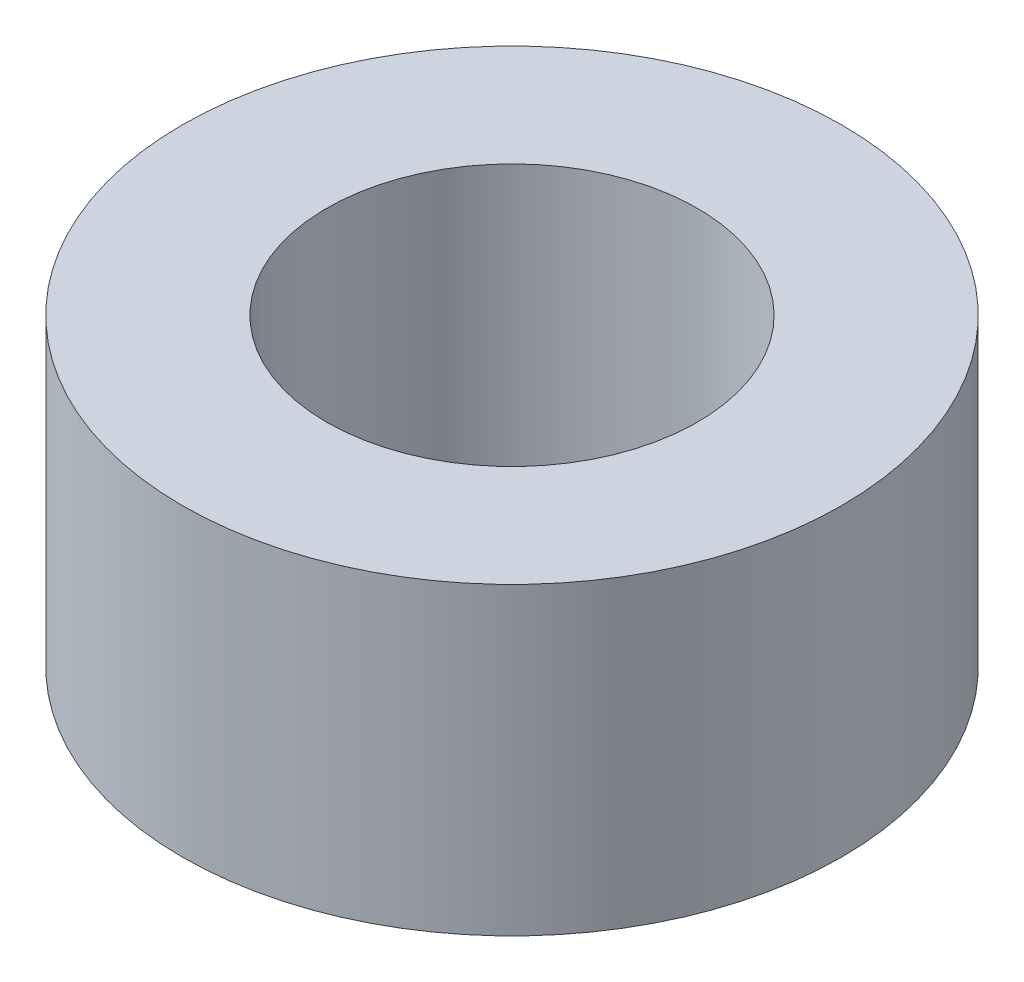
ISO-10303-21;
HEADER;
FILE_DESCRIPTION(('STEP AP214'),'2;1');
FILE_NAME('part.step','',(''),(''),'','','');
FILE_SCHEMA(('AUTOMOTIVE_DESIGN { 1 0 10303 214 1 1 1 1 }'));
ENDSEC;
DATA;
#1=APPLICATION_CONTEXT('core data for automotive mechanical design processes');
#2=APPLICATION_PROTOCOL_DEFINITION('international standard','automotive_design',2000,#1);
#3=PRODUCT_CONTEXT('',#1,'mechanical');
#4=PRODUCT('Part','Part','',(#3));
#5=PRODUCT_RELATED_PRODUCT_CATEGORY('part','',(#4));
#6=PRODUCT_DEFINITION_FORMATION('','',#4);
#7=PRODUCT_DEFINITION_CONTEXT('part definition',#1,'design');
#8=PRODUCT_DEFINITION('design','',#6,#7);
#9=PRODUCT_DEFINITION_SHAPE('','',#8);
#10=(LENGTH_UNIT() NAMED_UNIT(*) SI_UNIT(.MILLI.,.METRE.));
#11=(NAMED_UNIT(*) PLANE_ANGLE_UNIT() SI_UNIT($,.RADIAN.));
#12=(NAMED_UNIT(*) SI_UNIT($,.STERADIAN.) SOLID_ANGLE_UNIT());
#13=UNCERTAINTY_MEASURE_WITH_UNIT(LENGTH_MEASURE(1.E-05),#10,'distance_accuracy_value','');
#14=(GEOMETRIC_REPRESENTATION_CONTEXT(3) GLOBAL_UNCERTAINTY_ASSIGNED_CONTEXT((#13)) GLOBAL_UNIT_ASSIGNED_CONTEXT((#10,
#11,#12)) REPRESENTATION_CONTEXT('',''));
#15=CARTESIAN_POINT('',(0.,0.,0.));
#16=DIRECTION('',(0.,0.,1.));
#17=DIRECTION('',(1.,0.,0.));
#18=AXIS2_PLACEMENT_3D('',#15,#16,#17);
#19=CARTESIAN_POINT('',(0.,13.14,0.));
#20=DIRECTION('',(0.,-1.,0.));
#21=DIRECTION('',(0.,0.,-1.));
#22=AXIS2_PLACEMENT_3D('',#19,#20,#21);
#23=CYLINDRICAL_SURFACE('',#22,14.23);
#24=CARTESIAN_POINT('',(0.,13.14,0.));
#25=DIRECTION('',(0.,1.,0.));
#26=DIRECTION('',(0.,0.,1.));
#27=AXIS2_PLACEMENT_3D('',#24,#25,#26);
#28=CIRCLE('',#27,14.23);
#29=CARTESIAN_POINT('',(0.,13.14,14.23));
#30=VERTEX_POINT('',#29);
#31=EDGE_CURVE('E10',#30,#30,#28,.T.);
#32=ORIENTED_EDGE('',*,*,#31,.F.);
#33=EDGE_LOOP('',(#32));
#34=FACE_BOUND('',#33,.T.);
#35=CARTESIAN_POINT('',(0.,0.,0.));
#36=DIRECTION('',(0.,1.,0.));
#37=DIRECTION('',(0.,0.,1.));
#38=AXIS2_PLACEMENT_3D('',#35,#36,#37);
#39=CIRCLE('',#38,14.23);
#40=CARTESIAN_POINT('',(0.,0.,14.23));
#41=VERTEX_POINT('',#40);
#42=EDGE_CURVE('E33',#41,#41,#39,.T.);
#43=ORIENTED_EDGE('',*,*,#42,.T.);
#44=EDGE_LOOP('',(#43));
#45=FACE_BOUND('',#44,.T.);
#46=ADVANCED_FACE('F30',(#34,#45),#23,.T.);
#47=CARTESIAN_POINT('',(0.,13.14,0.));
#48=DIRECTION('',(0.,1.,0.));
#49=DIRECTION('',(0.,0.,1.));
#50=AXIS2_PLACEMENT_3D('',#47,#48,#49);
#51=PLANE('',#50);
#52=CARTESIAN_POINT('',(0.,13.14,0.));
#53=DIRECTION('',(0.,1.,0.));
#54=DIRECTION('',(0.,0.,1.));
#55=AXIS2_PLACEMENT_3D('',#52,#53,#54);
#56=CIRCLE('',#55,8.);
#57=CARTESIAN_POINT('',(0.,13.14,8.));
#58=VERTEX_POINT('',#57);
#59=EDGE_CURVE('E42',#58,#58,#56,.T.);
#60=ORIENTED_EDGE('',*,*,#59,.F.);
#61=EDGE_LOOP('',(#60));
#62=FACE_BOUND('',#61,.T.);
#63=ORIENTED_EDGE('',*,*,#31,.T.);
#64=EDGE_LOOP('',(#63));
#65=FACE_BOUND('',#64,.T.);
#66=ADVANCED_FACE('F57',(#62,#65),#51,.T.);
#67=CARTESIAN_POINT('',(0.,0.,0.));
#68=DIRECTION('',(0.,1.,0.));
#69=DIRECTION('',(0.,0.,1.));
#70=AXIS2_PLACEMENT_3D('',#67,#68,#69);
#71=PLANE('',#70);
#72=CARTESIAN_POINT('',(0.,0.,0.));
#73=DIRECTION('',(0.,1.,0.));
#74=DIRECTION('',(0.,0.,1.));
#75=AXIS2_PLACEMENT_3D('',#72,#73,#74);
#76=CIRCLE('',#75,8.);
#77=CARTESIAN_POINT('',(0.,0.,8.));
#78=VERTEX_POINT('',#77);
#79=EDGE_CURVE('E40',#78,#78,#76,.T.);
#80=ORIENTED_EDGE('',*,*,#79,.T.);
#81=EDGE_LOOP('',(#80));
#82=FACE_BOUND('',#81,.T.);
#83=ORIENTED_EDGE('',*,*,#42,.F.);
#84=EDGE_LOOP('',(#83));
#85=FACE_BOUND('',#84,.T.);
#86=ADVANCED_FACE('F48',(#82,#85),#71,.F.);
#87=CARTESIAN_POINT('',(0.,0.,0.));
#88=DIRECTION('',(0.,1.,0.));
#89=DIRECTION('',(0.,0.,1.));
#90=AXIS2_PLACEMENT_3D('',#87,#88,#89);
#91=CYLINDRICAL_SURFACE('',#90,8.);
#92=ORIENTED_EDGE('',*,*,#79,.F.);
#93=EDGE_LOOP('',(#92));
#94=FACE_BOUND('',#93,.T.);
#95=ORIENTED_EDGE('',*,*,#59,.T.);
#96=EDGE_LOOP('',(#95));
#97=FACE_BOUND('',#96,.T.);
#98=ADVANCED_FACE('F51',(#94,#97),#91,.F.);
#99=CLOSED_SHELL('',(#46,#66,#86,#98));
#100=MANIFOLD_SOLID_BREP('B2',#99);
#101=ADVANCED_BREP_SHAPE_REPRESENTATION('',(#18,#100),#14);
#102=SHAPE_DEFINITION_REPRESENTATION(#9,#101);
ENDSEC;
END-ISO-10303-21;
